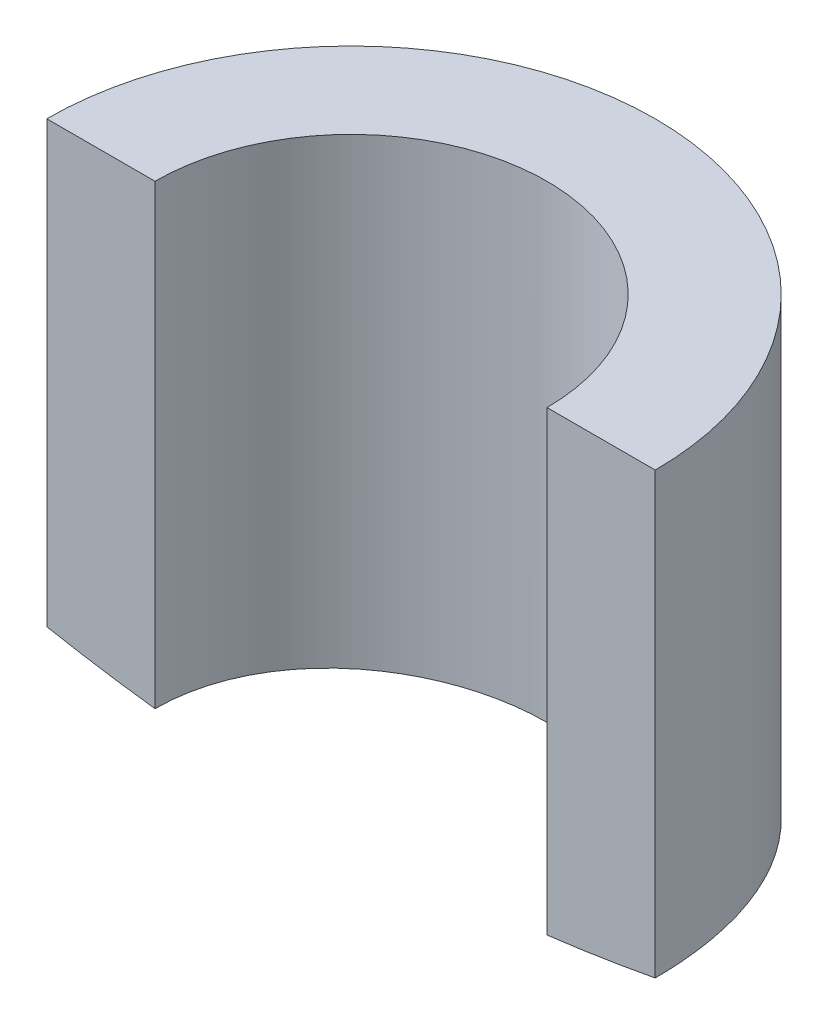
ISO-10303-21;
HEADER;
FILE_DESCRIPTION(('STEP AP214'),'2;1');
FILE_NAME('part.step','',(''),(''),'','','');
FILE_SCHEMA(('AUTOMOTIVE_DESIGN { 1 0 10303 214 1 1 1 1 }'));
ENDSEC;
DATA;
#1=APPLICATION_CONTEXT('core data for automotive mechanical design processes');
#2=APPLICATION_PROTOCOL_DEFINITION('international standard','automotive_design',2000,#1);
#3=PRODUCT_CONTEXT('',#1,'mechanical');
#4=PRODUCT('Part','Part','',(#3));
#5=PRODUCT_RELATED_PRODUCT_CATEGORY('part','',(#4));
#6=PRODUCT_DEFINITION_FORMATION('','',#4);
#7=PRODUCT_DEFINITION_CONTEXT('part definition',#1,'design');
#8=PRODUCT_DEFINITION('design','',#6,#7);
#9=PRODUCT_DEFINITION_SHAPE('','',#8);
#10=(LENGTH_UNIT() NAMED_UNIT(*) SI_UNIT(.MILLI.,.METRE.));
#11=(NAMED_UNIT(*) PLANE_ANGLE_UNIT() SI_UNIT($,.RADIAN.));
#12=(NAMED_UNIT(*) SI_UNIT($,.STERADIAN.) SOLID_ANGLE_UNIT());
#13=UNCERTAINTY_MEASURE_WITH_UNIT(LENGTH_MEASURE(1.E-05),#10,'distance_accuracy_value','');
#14=(GEOMETRIC_REPRESENTATION_CONTEXT(3) GLOBAL_UNCERTAINTY_ASSIGNED_CONTEXT((#13)) GLOBAL_UNIT_ASSIGNED_CONTEXT((#10,
#11,#12)) REPRESENTATION_CONTEXT('',''));
#15=CARTESIAN_POINT('',(0.,0.,0.));
#16=DIRECTION('',(0.,0.,1.));
#17=DIRECTION('',(1.,0.,0.));
#18=AXIS2_PLACEMENT_3D('',#15,#16,#17);
#19=CARTESIAN_POINT('',(0.,11.,0.));
#20=DIRECTION('',(0.,-1.,0.));
#21=DIRECTION('',(0.,0.,-1.));
#22=AXIS2_PLACEMENT_3D('',#19,#20,#21);
#23=CYLINDRICAL_SURFACE('',#22,7.14);
#24=DIRECTION('',(0.,-1.,0.));
#25=VECTOR('',#24,1.);
#26=CARTESIAN_POINT('',(7.14,11.,0.));
#27=LINE('',#26,#25);
#28=CARTESIAN_POINT('',(7.14,11.,0.));
#29=VERTEX_POINT('',#28);
#30=CARTESIAN_POINT('',(7.14,0.675003006012149,0.));
#31=VERTEX_POINT('',#30);
#32=EDGE_CURVE('E96',#29,#31,#27,.T.);
#33=ORIENTED_EDGE('',*,*,#32,.T.);
#34=CARTESIAN_POINT('',(-7.14000000000001,0.675003006012156,0.));
#35=CARTESIAN_POINT('',(-7.14002353349183,0.675019598823135,-0.198933916834818));
#36=CARTESIAN_POINT('',(-7.1316870118457,0.673417408381402,-0.39786205631845));
#37=CARTESIAN_POINT('',(-7.09846566830605,0.667095853036239,-0.794259884087191));
#38=CARTESIAN_POINT('',(-7.0735827366919,0.662376844201855,-0.991729736363368));
#39=CARTESIAN_POINT('',(-7.00748729456647,0.649950826034246,-1.38353167743954));
#40=CARTESIAN_POINT('',(-6.96629803347003,0.642248071233959,-1.57786782545132));
#41=CARTESIAN_POINT('',(-6.86791743719029,0.624084713492121,-1.96231328733556));
#42=CARTESIAN_POINT('',(-6.81072606939763,0.613624104930573,-2.15242259259364));
#43=CARTESIAN_POINT('',(-6.68077800660826,0.59024720986356,-2.52707714209818));
#44=CARTESIAN_POINT('',(-6.60802204227729,0.577331038635405,-2.71162264706833));
#45=CARTESIAN_POINT('',(-6.44745373579338,0.549407728012981,-3.07395875964704));
#46=CARTESIAN_POINT('',(-6.35963582480265,0.53439981562738,-3.25174683903277));
#47=CARTESIAN_POINT('',(-6.16962623769822,0.502726422298235,-3.59923792031256));
#48=CARTESIAN_POINT('',(-6.06743914309469,0.486061470183919,-3.76894347626178));
#49=CARTESIAN_POINT('',(-5.84934711552299,0.451529551180899,-4.09925868639601));
#50=CARTESIAN_POINT('',(-5.73343706769717,0.433662137184834,-4.25986491586871));
#51=CARTESIAN_POINT('',(-5.48741858100205,0.397031111763799,-4.57250752580981));
#52=CARTESIAN_POINT('',(-5.35717197186096,0.378259977822779,-4.72443431446846));
#53=CARTESIAN_POINT('',(-5.08435435782656,0.340520318815046,-5.01686579959617));
#54=CARTESIAN_POINT('',(-4.94177880489084,0.32155172319565,-5.15736624357713));
#55=CARTESIAN_POINT('',(-4.64534477387761,0.283957330112583,-5.42589702858486));
#56=CARTESIAN_POINT('',(-4.49148869302648,0.26533146086251,-5.55393000568782));
#57=CARTESIAN_POINT('',(-4.17344956987163,0.228930018855421,-5.79671953103829));
#58=CARTESIAN_POINT('',(-4.00926274171702,0.21115476206834,-5.9114711678889));
#59=CARTESIAN_POINT('',(-3.67047223356674,0.1768298827955,-6.12763481665274));
#60=CARTESIAN_POINT('',(-3.49580020882127,0.160290350193857,-6.22894135868906));
#61=CARTESIAN_POINT('',(-3.1383723646993,0.129053255154743,-6.41645915947358));
#62=CARTESIAN_POINT('',(-2.95561649491941,0.114355704204356,-6.50267032408435));
#63=CARTESIAN_POINT('',(-2.58333547740856,0.0872231865127194,-6.65933602180847));
#64=CARTESIAN_POINT('',(-2.39381121548963,0.074787924983528,-6.72979260809889));
#65=CARTESIAN_POINT('',(-2.00932665566792,0.0525338200237529,-6.85441796475222));
#66=CARTESIAN_POINT('',(-1.81436630112865,0.042715003864137,-6.90858656534772));
#67=CARTESIAN_POINT('',(-1.42275443831251,0.0260755303217721,-6.99966476172653));
#68=CARTESIAN_POINT('',(-1.22614988737212,0.0192209254439743,-7.0367701039015));
#69=CARTESIAN_POINT('',(-0.830370220442168,0.00853527769251129,-7.09437015618445));
#70=CARTESIAN_POINT('',(-0.631194243680368,0.00470527544094775,-7.11485914946127));
#71=CARTESIAN_POINT('',(-0.231837355689276,0.000182174853678502,-7.13903773737821));
#72=CARTESIAN_POINT('',(-0.0316566952667964,-0.000511670846725535,-7.14273133446208));
#73=CARTESIAN_POINT('',(0.368297989025912,0.00125529232732697,-7.13330006923442));
#74=CARTESIAN_POINT('',(0.56807200607509,0.00371615368925156,-7.12017492709563));
#75=CARTESIAN_POINT('',(0.963253264724314,0.0116722174256247,-7.07748154082539));
#76=CARTESIAN_POINT('',(1.15868384395582,0.0171289488704831,-7.048121737641));
#77=CARTESIAN_POINT('',(1.54634103306302,0.0308990450497842,-6.97333469222803));
#78=CARTESIAN_POINT('',(1.73856767523819,0.0392123809679924,-6.92790761207931));
#79=CARTESIAN_POINT('',(2.11848056908391,0.0584671625774157,-6.82133159746464));
#80=CARTESIAN_POINT('',(2.30616670658723,0.0694086742764928,-6.76018226812435));
#81=CARTESIAN_POINT('',(2.67570055694862,0.0936200645699076,-6.62262007549953));
#82=CARTESIAN_POINT('',(2.85754831123037,0.106889926640143,-6.54620732053769));
#83=CARTESIAN_POINT('',(3.21521598210008,0.135480206650428,-6.37818570807988));
#84=CARTESIAN_POINT('',(3.39099457593695,0.150812128222266,-6.2864908551022));
#85=CARTESIAN_POINT('',(3.73415373002915,0.183040865231258,-6.08891465834176));
#86=CARTESIAN_POINT('',(3.90153720830743,0.199937131030923,-5.98303829148375));
#87=CARTESIAN_POINT('',(4.22692364442587,0.234845755495744,-5.75776765070823));
#88=CARTESIAN_POINT('',(4.38492274308166,0.252858567185415,-5.63836787336714));
#89=CARTESIAN_POINT('',(4.69036483154032,0.289497037562713,-5.386946427917));
#90=CARTESIAN_POINT('',(4.83781150922616,0.308122478792832,-5.25492920742246));
#91=CARTESIAN_POINT('',(5.12344530305961,0.345776577291425,-4.97697052750454));
#92=CARTESIAN_POINT('',(5.26145224310344,0.364806994038823,-4.8308440878314));
#93=CARTESIAN_POINT('',(5.52463673707465,0.402439612543338,-4.52750429831859));
#94=CARTESIAN_POINT('',(5.64981890031871,0.421041966272297,-4.37029496628628));
#95=CARTESIAN_POINT('',(5.88661566054417,0.457309899621446,-4.04570631933615));
#96=CARTESIAN_POINT('',(5.99822125283559,0.474974853177867,-3.87832036392605));
#97=CARTESIAN_POINT('',(6.20693126432863,0.508841701809158,-3.53468523697126));
#98=CARTESIAN_POINT('',(6.30404118739695,0.525044151254398,-3.35843946356675));
#99=CARTESIAN_POINT('',(6.48333747889407,0.555564564391562,-2.99776593971246));
#100=CARTESIAN_POINT('',(6.56548345422988,0.569877399518934,-2.81331766787246));
#101=CARTESIAN_POINT('',(6.71388090664287,0.596140417912657,-2.43805188480854));
#102=CARTESIAN_POINT('',(6.78013856415062,0.608091519555491,-2.24723688320308));
#103=CARTESIAN_POINT('',(6.89622317268999,0.629270255539438,-1.86074676843959));
#104=CARTESIAN_POINT('',(6.94606731217775,0.638500737879427,-1.66507697176361));
#105=CARTESIAN_POINT('',(7.02900494492224,0.653973903085865,-1.27018373657483));
#106=CARTESIAN_POINT('',(7.06210643219395,0.660218011760805,-1.0709620410955));
#107=CARTESIAN_POINT('',(7.10446667856891,0.668236976912685,-0.726191202471305));
#108=CARTESIAN_POINT('',(7.11779824448856,0.670772219033678,-0.581146684702389));
#109=CARTESIAN_POINT('',(7.13555977595866,0.674155906371683,-0.290739288012074));
#110=CARTESIAN_POINT('',(7.14000468350711,0.675007182977227,-0.1453773555807));
#111=CARTESIAN_POINT('',(7.14,0.675003006012147,0.));
#112=B_SPLINE_CURVE_WITH_KNOTS('',3,(#34,#35,#36,#37,#38,#39,#40,#41,#42,#43,#44,#45,#46,#47,
#48,#49,#50,#51,#52,#53,#54,#55,#56,#57,#58,#59,#60,#61,#62,#63,#64,#65,#66,#67,#68,#69,#70,#71,
#72,#73,#74,#75,#76,#77,#78,#79,#80,#81,#82,#83,#84,#85,#86,#87,#88,#89,#90,#91,#92,#93,#94,#95,
#96,#97,#98,#99,#100,#101,#102,#103,#104,#105,#106,#107,#108,#109,#110,#111),.UNSPECIFIED.,.F.,
.F.,(4,2,2,2,2,2,2,2,2,2,2,2,2,2,2,2,2,2,2,2,2,2,2,2,2,2,2,2,2,2,2,2,2,2,2,2,2,2,4),(0.,
0.596612052317169,1.19315595874891,1.78885236403029,2.38454998324011,2.98021964410449,
3.57611001793032,4.17181082542546,4.76773436736401,5.37000979016322,5.97250834284405,
6.57487922753378,7.17747216009256,7.78454322371833,8.39161807301128,8.9986137605824,
9.60561577456592,10.2054691199872,10.8055287566485,11.4054453879992,12.005372000788,
12.597769077669,13.1901601788708,13.7825661598076,14.3749679366602,14.970823390587,
15.566470277529,16.162360443047,16.7580413282092,17.3630081434632,17.9677567608531,
18.5729043171096,19.1778215169724,19.7843481619873,20.3906384887878,20.9962918660066,
21.6016557918686,22.0384221848595,22.4744535805868),.UNSPECIFIED.);
#113=CARTESIAN_POINT('',(-7.14,0.675003006012149,0.));
#114=VERTEX_POINT('',#113);
#115=EDGE_CURVE('E57',#114,#31,#112,.T.);
#116=ORIENTED_EDGE('',*,*,#115,.F.);
#117=DIRECTION('',(0.,-1.,0.));
#118=VECTOR('',#117,1.);
#119=CARTESIAN_POINT('',(-7.14,11.,0.));
#120=LINE('',#119,#118);
#121=CARTESIAN_POINT('',(-7.14,11.,0.));
#122=VERTEX_POINT('',#121);
#123=EDGE_CURVE('E11',#122,#114,#120,.T.);
#124=ORIENTED_EDGE('',*,*,#123,.F.);
#125=CARTESIAN_POINT('',(0.,11.,0.));
#126=DIRECTION('',(0.,1.,0.));
#127=DIRECTION('',(0.,0.,1.));
#128=AXIS2_PLACEMENT_3D('',#125,#126,#127);
#129=CIRCLE('',#128,7.14);
#130=EDGE_CURVE('E104',#29,#122,#129,.T.);
#131=ORIENTED_EDGE('',*,*,#130,.F.);
#132=EDGE_LOOP('',(#33,#116,#124,#131));
#133=FACE_BOUND('',#132,.T.);
#134=ADVANCED_FACE('F42',(#133),#23,.T.);
#135=CARTESIAN_POINT('',(-4.6,11.,0.));
#136=DIRECTION('',(0.,0.,-1.));
#137=DIRECTION('',(-1.,0.,0.));
#138=AXIS2_PLACEMENT_3D('',#135,#136,#137);
#139=PLANE('',#138);
#140=ORIENTED_EDGE('',*,*,#123,.T.);
#141=CARTESIAN_POINT('',(0.,38.1,0.));
#142=DIRECTION('',(0.,0.,-1.));
#143=DIRECTION('',(1.,0.,0.));
#144=AXIS2_PLACEMENT_3D('',#141,#142,#143);
#145=CIRCLE('',#144,38.1);
#146=CARTESIAN_POINT('',(-4.6,0.278709699429877,0.));
#147=VERTEX_POINT('',#146);
#148=EDGE_CURVE('E83',#147,#114,#145,.T.);
#149=ORIENTED_EDGE('',*,*,#148,.F.);
#150=DIRECTION('',(0.,-1.,0.));
#151=VECTOR('',#150,1.);
#152=CARTESIAN_POINT('',(-4.6,11.,0.));
#153=LINE('',#152,#151);
#154=CARTESIAN_POINT('',(-4.6,11.,0.));
#155=VERTEX_POINT('',#154);
#156=EDGE_CURVE('E50',#155,#147,#153,.T.);
#157=ORIENTED_EDGE('',*,*,#156,.F.);
#158=DIRECTION('',(1.,0.,0.));
#159=VECTOR('',#158,1.);
#160=CARTESIAN_POINT('',(-4.6,11.,0.));
#161=LINE('',#160,#159);
#162=EDGE_CURVE('E100',#122,#155,#161,.T.);
#163=ORIENTED_EDGE('',*,*,#162,.F.);
#164=EDGE_LOOP('',(#140,#149,#157,#163));
#165=FACE_BOUND('',#164,.T.);
#166=ADVANCED_FACE('F99',(#165),#139,.F.);
#167=CARTESIAN_POINT('',(0.,11.,0.));
#168=DIRECTION('',(0.,-1.,0.));
#169=DIRECTION('',(0.,0.,-1.));
#170=AXIS2_PLACEMENT_3D('',#167,#168,#169);
#171=CYLINDRICAL_SURFACE('',#170,4.6);
#172=ORIENTED_EDGE('',*,*,#156,.T.);
#173=CARTESIAN_POINT('',(-4.6,0.278709699429877,0.));
#174=CARTESIAN_POINT('',(-4.60001443095967,0.278716442884543,-0.128875031312286));
#175=CARTESIAN_POINT('',(-4.59458471129686,0.278051221504639,-0.257747358002057));
#176=CARTESIAN_POINT('',(-4.57294168643344,0.275425660948872,-0.514560710307707));
#177=CARTESIAN_POINT('',(-4.55672919039903,0.273465418954633,-0.642501805077275));
#178=CARTESIAN_POINT('',(-4.51364688680764,0.268301203078294,-0.896419185526906));
#179=CARTESIAN_POINT('',(-4.48678777035347,0.265098476940034,-1.02239731088487));
#180=CARTESIAN_POINT('',(-4.42261511653079,0.257543348997571,-1.27162540025194));
#181=CARTESIAN_POINT('',(-4.38530164576046,0.2531909545172,-1.39487538163498));
#182=CARTESIAN_POINT('',(-4.30048565705665,0.24345972110229,-1.63779653118774));
#183=CARTESIAN_POINT('',(-4.25298162051229,0.238080729196111,-1.75746716292644));
#184=CARTESIAN_POINT('',(-4.14811247218162,0.226447937703556,-1.9924152416176));
#185=CARTESIAN_POINT('',(-4.09074371955698,0.220193815286054,-2.10769104728176));
#186=CARTESIAN_POINT('',(-3.96659647572218,0.206992663105391,-2.33294730558349));
#187=CARTESIAN_POINT('',(-3.89982234527684,0.20004595489045,-2.44293018073851));
#188=CARTESIAN_POINT('',(-3.75729003205015,0.185650447164278,-2.65693550801675));
#189=CARTESIAN_POINT('',(-3.68152852402293,0.178201462258057,-2.76095573276967));
#190=CARTESIAN_POINT('',(-3.52123511482135,0.162981014285,-2.9626966199364));
#191=CARTESIAN_POINT('',(-3.43666767145217,0.155208326836886,-3.060388951366));
#192=CARTESIAN_POINT('',(-3.25958794700286,0.13958657698652,-3.24834790276246));
#193=CARTESIAN_POINT('',(-3.16707273938028,0.131737487402789,-3.33861176324055));
#194=CARTESIAN_POINT('',(-2.97479081408359,0.116188728576714,-3.51102414616872));
#195=CARTESIAN_POINT('',(-2.87502566245464,0.108489027517863,-3.5931744122281));
#196=CARTESIAN_POINT('',(-2.66888325776698,0.0934513006408017,-3.7488330711897));
#197=CARTESIAN_POINT('',(-2.56250357868953,0.0861134093144035,-3.82233826440451));
#198=CARTESIAN_POINT('',(-2.34361257303359,0.0719900836973341,-3.96033636748127));
#199=CARTESIAN_POINT('',(-2.23108547814806,0.0652061932945143,-4.02480442802128));
#200=CARTESIAN_POINT('',(-2.00091372965795,0.0524030536129663,-4.14405000253815));
#201=CARTESIAN_POINT('',(-1.88326719349045,0.0463840888637556,-4.19882391353793));
#202=CARTESIAN_POINT('',(-1.64378330836194,0.0352875349552783,-4.29822938523503));
#203=CARTESIAN_POINT('',(-1.52194789467562,0.0302095178236098,-4.3428655589876));
#204=CARTESIAN_POINT('',(-1.27486359116655,0.0211342529394549,-4.42171346786318));
#205=CARTESIAN_POINT('',(-1.14961346928269,0.017137401118692,-4.4559213846525));
#206=CARTESIAN_POINT('',(-0.897287946547174,0.0103597171376471,-4.51348189499139));
#207=CARTESIAN_POINT('',(-0.770225519552387,0.00757263388571316,-4.53689033186659));
#208=CARTESIAN_POINT('',(-0.514566137532994,0.00325943229223136,-4.57295656183689));
#209=CARTESIAN_POINT('',(-0.385968664661287,0.00173375242206766,-4.58561061668692));
#210=CARTESIAN_POINT('',(0.000749345573865668,-0.000865859365275868,-4.60721372300757));
#211=CARTESIAN_POINT('',(0.260071615993651,3.00502606084745E-05,-4.59986654654724));
#212=CARTESIAN_POINT('',(0.644246423806323,0.00523030806460151,-4.55648610329214));
#213=CARTESIAN_POINT('',(0.771242474072684,0.00759750363790904,-4.53670764840648));
#214=CARTESIAN_POINT('',(1.02311349229895,0.013532153492341,-4.48661140250683));
#215=CARTESIAN_POINT('',(1.14798918157905,0.0170991906462338,-4.4562972741184));
#216=CARTESIAN_POINT('',(1.39476553901026,0.0253378332703994,-4.38533144702711));
#217=CARTESIAN_POINT('',(1.51666511852868,0.0300098364411523,-4.34467602587706));
#218=CARTESIAN_POINT('',(1.75656155239627,0.0403245451792015,-4.25334625635755));
#219=CARTESIAN_POINT('',(1.87455979400345,0.0459669011796099,-4.202675515001));
#220=CARTESIAN_POINT('',(2.10621002710862,0.0580839834713865,-4.09150749345166));
#221=CARTESIAN_POINT('',(2.219848404241,0.0645610790254078,-4.03098210856883));
#222=CARTESIAN_POINT('',(2.4415858707457,0.0781511011944584,-3.90066529296779));
#223=CARTESIAN_POINT('',(2.54968694729416,0.0852637971601001,-3.83087721910825));
#224=CARTESIAN_POINT('',(2.75968338631922,0.0999311533749342,-3.68248332479893));
#225=CARTESIAN_POINT('',(2.86157651404271,0.107485970883795,-3.60387435758287));
#226=CARTESIAN_POINT('',(3.05837528623581,0.122821580859578,-3.43843852132558));
#227=CARTESIAN_POINT('',(3.15328344553498,0.130602290576633,-3.35161463592579));
#228=CARTESIAN_POINT('',(3.33610199167583,0.146226825662546,-3.16972551543047));
#229=CARTESIAN_POINT('',(3.42396183648578,0.154070727593852,-3.07460947822413));
#230=CARTESIAN_POINT('',(3.59133029049668,0.169545091467541,-2.87733779769025));
#231=CARTESIAN_POINT('',(3.67084194281188,0.177175630436401,-2.77518474216845));
#232=CARTESIAN_POINT('',(3.82103980502829,0.192014615990966,-2.56445081503693));
#233=CARTESIAN_POINT('',(3.89172004089725,0.199222775125186,-2.45586566483394));
#234=CARTESIAN_POINT('',(4.02366301872476,0.213003072179462,-2.2331332711728));
#235=CARTESIAN_POINT('',(4.08492927597722,0.219575447167764,-2.11898812495656));
#236=CARTESIAN_POINT('',(4.19771037911731,0.231907205260746,-1.88574412260299));
#237=CARTESIAN_POINT('',(4.24921192092985,0.237665476501642,-1.76663877386579));
#238=CARTESIAN_POINT('',(4.34196592223265,0.248190116603247,-1.52451045857004));
#239=CARTESIAN_POINT('',(4.38322228655566,0.252956863259442,-1.40148900482193));
#240=CARTESIAN_POINT('',(4.45516717121851,0.261358415047666,-1.15250234375958));
#241=CARTESIAN_POINT('',(4.48586701240064,0.264994432373889,-1.02654044562302));
#242=CARTESIAN_POINT('',(4.53651987284605,0.271034386528363,-0.772496769329745));
#243=CARTESIAN_POINT('',(4.55647810299742,0.273438920736818,-0.644416050178754));
#244=CARTESIAN_POINT('',(4.58066343307768,0.276361676244147,-0.430067553988236));
#245=CARTESIAN_POINT('',(4.58791893202041,0.277241763100235,-0.344134532922035));
#246=CARTESIAN_POINT('',(4.5975839666192,0.278415840015167,-0.172137207852965));
#247=CARTESIAN_POINT('',(4.60000161764381,0.278710811582981,-0.0860733664749409));
#248=CARTESIAN_POINT('',(4.6,0.27870969942988,0.));
#249=B_SPLINE_CURVE_WITH_KNOTS('',3,(#173,#174,#175,#176,#177,#178,#179,#180,#181,#182,#183,
#184,#185,#186,#187,#188,#189,#190,#191,#192,#193,#194,#195,#196,#197,#198,#199,#200,#201,#202,
#203,#204,#205,#206,#207,#208,#209,#210,#211,#212,#213,#214,#215,#216,#217,#218,#219,#220,#221,
#222,#223,#224,#225,#226,#227,#228,#229,#230,#231,#232,#233,#234,#235,#236,#237,#238,#239,#240,
#241,#242,#243,#244,#245,#246,#247,#248),.UNSPECIFIED.,.F.,.F.,(4,2,2,2,2,2,2,2,2,2,2,2,2,2,2,2,
2,2,2,2,2,2,2,2,2,2,2,2,2,2,2,2,2,2,2,2,2,4),(0.,0.386505099253146,0.772981197479623,
1.15907018406635,1.5451567111764,1.93130081340206,2.31758773957834,2.70369615136922,
3.08994786786536,3.47782388246197,3.86584333883619,4.25377922766305,4.64185824925521,
5.03098427183958,5.42025461665824,5.80934747221296,6.19858262449467,6.5857818666627,
6.97311564509049,7.74694360481441,8.13224820179363,8.51741898509657,8.90272861099388,
9.28789971983479,9.67418919338362,10.0603390534319,10.4466271092087,10.8327754006123,
11.221482682701,11.610047776193,11.9988743085844,12.3875552937264,12.7767620960825,
13.1658203282319,13.5544600225387,13.9429110126068,14.2015119594919,14.4596787449002),.UNSPECIFIED.);
#250=CARTESIAN_POINT('',(4.6,0.278709699429877,0.));
#251=VERTEX_POINT('',#250);
#252=EDGE_CURVE('E85',#147,#251,#249,.T.);
#253=ORIENTED_EDGE('',*,*,#252,.T.);
#254=DIRECTION('',(0.,-1.,0.));
#255=VECTOR('',#254,1.);
#256=CARTESIAN_POINT('',(4.6,11.,0.));
#257=LINE('',#256,#255);
#258=CARTESIAN_POINT('',(4.6,11.,0.));
#259=VERTEX_POINT('',#258);
#260=EDGE_CURVE('E124',#259,#251,#257,.T.);
#261=ORIENTED_EDGE('',*,*,#260,.F.);
#262=CARTESIAN_POINT('',(0.,11.,0.));
#263=DIRECTION('',(0.,-1.,0.));
#264=DIRECTION('',(0.,0.,1.));
#265=AXIS2_PLACEMENT_3D('',#262,#263,#264);
#266=CIRCLE('',#265,4.6);
#267=EDGE_CURVE('E103',#155,#259,#266,.T.);
#268=ORIENTED_EDGE('',*,*,#267,.F.);
#269=EDGE_LOOP('',(#172,#253,#261,#268));
#270=FACE_BOUND('',#269,.T.);
#271=ADVANCED_FACE('F129',(#270),#171,.F.);
#272=CARTESIAN_POINT('',(4.6,11.,0.));
#273=DIRECTION('',(0.,0.,-1.));
#274=DIRECTION('',(-1.,0.,0.));
#275=AXIS2_PLACEMENT_3D('',#272,#273,#274);
#276=PLANE('',#275);
#277=ORIENTED_EDGE('',*,*,#260,.T.);
#278=EDGE_CURVE('E90',#31,#251,#145,.T.);
#279=ORIENTED_EDGE('',*,*,#278,.F.);
#280=ORIENTED_EDGE('',*,*,#32,.F.);
#281=DIRECTION('',(1.,0.,0.));
#282=VECTOR('',#281,1.);
#283=CARTESIAN_POINT('',(4.6,11.,0.));
#284=LINE('',#283,#282);
#285=EDGE_CURVE('E65',#259,#29,#284,.T.);
#286=ORIENTED_EDGE('',*,*,#285,.F.);
#287=EDGE_LOOP('',(#277,#279,#280,#286));
#288=FACE_BOUND('',#287,.T.);
#289=ADVANCED_FACE('F132',(#288),#276,.F.);
#290=CARTESIAN_POINT('',(0.,11.,0.));
#291=DIRECTION('',(0.,1.,0.));
#292=DIRECTION('',(0.,0.,1.));
#293=AXIS2_PLACEMENT_3D('',#290,#291,#292);
#294=PLANE('',#293);
#295=ORIENTED_EDGE('',*,*,#130,.T.);
#296=ORIENTED_EDGE('',*,*,#162,.T.);
#297=ORIENTED_EDGE('',*,*,#267,.T.);
#298=ORIENTED_EDGE('',*,*,#285,.T.);
#299=EDGE_LOOP('',(#295,#296,#297,#298));
#300=FACE_BOUND('',#299,.T.);
#301=ADVANCED_FACE('F106',(#300),#294,.T.);
#302=CARTESIAN_POINT('',(0.,38.1,-7.141));
#303=DIRECTION('',(0.,0.,1.));
#304=DIRECTION('',(1.,0.,0.));
#305=AXIS2_PLACEMENT_3D('',#302,#303,#304);
#306=CYLINDRICAL_SURFACE('',#305,38.1);
#307=ORIENTED_EDGE('',*,*,#148,.T.);
#308=ORIENTED_EDGE('',*,*,#115,.T.);
#309=ORIENTED_EDGE('',*,*,#278,.T.);
#310=ORIENTED_EDGE('',*,*,#252,.F.);
#311=EDGE_LOOP('',(#307,#308,#309,#310));
#312=FACE_BOUND('',#311,.T.);
#313=ADVANCED_FACE('F84',(#312),#306,.T.);
#314=CLOSED_SHELL('',(#134,#166,#271,#289,#301,#313));
#315=MANIFOLD_SOLID_BREP('B2',#314);
#316=ADVANCED_BREP_SHAPE_REPRESENTATION('',(#18,#315),#14);
#317=SHAPE_DEFINITION_REPRESENTATION(#9,#316);
ENDSEC;
END-ISO-10303-21;
